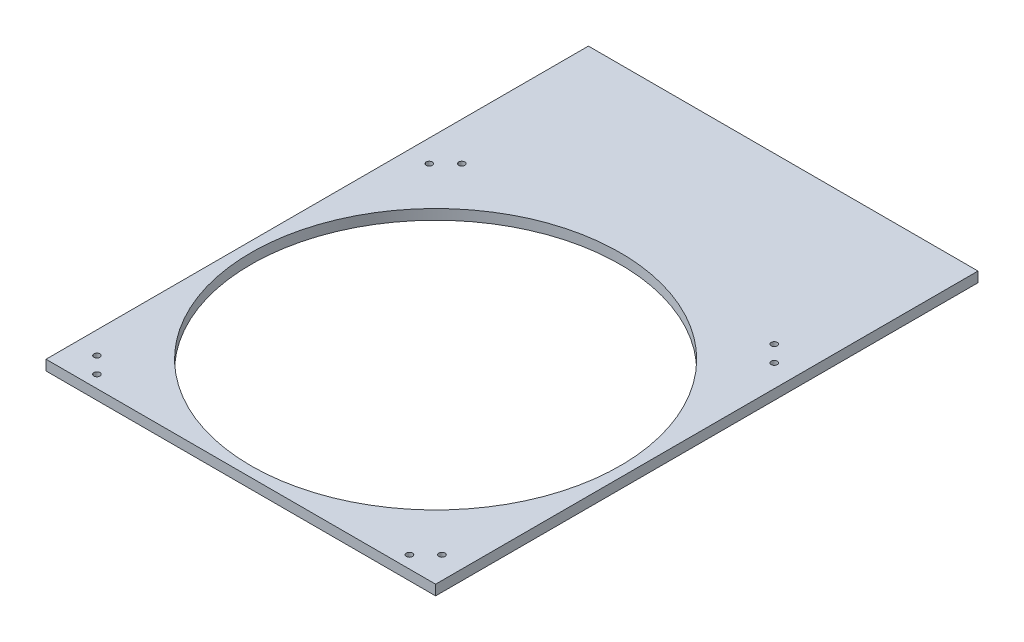
ISO-10303-21;
HEADER;
FILE_DESCRIPTION(('STEP AP214'),'2;1');
FILE_NAME('part.step','',(''),(''),'','','');
FILE_SCHEMA(('AUTOMOTIVE_DESIGN { 1 0 10303 214 1 1 1 1 }'));
ENDSEC;
DATA;
#1=APPLICATION_CONTEXT('core data for automotive mechanical design processes');
#2=APPLICATION_PROTOCOL_DEFINITION('international standard','automotive_design',2000,#1);
#3=PRODUCT_CONTEXT('',#1,'mechanical');
#4=PRODUCT('Part','Part','',(#3));
#5=PRODUCT_RELATED_PRODUCT_CATEGORY('part','',(#4));
#6=PRODUCT_DEFINITION_FORMATION('','',#4);
#7=PRODUCT_DEFINITION_CONTEXT('part definition',#1,'design');
#8=PRODUCT_DEFINITION('design','',#6,#7);
#9=PRODUCT_DEFINITION_SHAPE('','',#8);
#10=(LENGTH_UNIT() NAMED_UNIT(*) SI_UNIT(.MILLI.,.METRE.));
#11=(NAMED_UNIT(*) PLANE_ANGLE_UNIT() SI_UNIT($,.RADIAN.));
#12=(NAMED_UNIT(*) SI_UNIT($,.STERADIAN.) SOLID_ANGLE_UNIT());
#13=UNCERTAINTY_MEASURE_WITH_UNIT(LENGTH_MEASURE(1.E-05),#10,'distance_accuracy_value','');
#14=(GEOMETRIC_REPRESENTATION_CONTEXT(3) GLOBAL_UNCERTAINTY_ASSIGNED_CONTEXT((#13)) GLOBAL_UNIT_ASSIGNED_CONTEXT((#10,
#11,#12)) REPRESENTATION_CONTEXT('',''));
#15=CARTESIAN_POINT('',(0.,0.,0.));
#16=DIRECTION('',(0.,0.,1.));
#17=DIRECTION('',(1.,0.,0.));
#18=AXIS2_PLACEMENT_3D('',#15,#16,#17);
#19=CARTESIAN_POINT('',(0.,6.35,0.));
#20=DIRECTION('',(0.,1.,0.));
#21=DIRECTION('',(0.,0.,1.));
#22=AXIS2_PLACEMENT_3D('',#19,#20,#21);
#23=PLANE('',#22);
#24=CARTESIAN_POINT('',(333.354931760774,6.35,-271.862661640913));
#25=DIRECTION('',(0.,-1.,0.));
#26=DIRECTION('',(0.,0.,-1.));
#27=AXIS2_PLACEMENT_3D('',#24,#25,#26);
#28=CIRCLE('',#27,1.90500000000005);
#29=CARTESIAN_POINT('',(333.354931760774,6.35,-273.767661640913));
#30=VERTEX_POINT('',#29);
#31=EDGE_CURVE('E165',#30,#30,#28,.T.);
#32=ORIENTED_EDGE('',*,*,#31,.T.);
#33=EDGE_LOOP('',(#32));
#34=FACE_BOUND('',#33,.T.);
#35=CARTESIAN_POINT('',(333.354931760774,6.35,-44.4161144509628));
#36=DIRECTION('',(0.,-1.,0.));
#37=DIRECTION('',(0.,0.,1.));
#38=AXIS2_PLACEMENT_3D('',#35,#36,#37);
#39=CIRCLE('',#38,1.90500000000005);
#40=CARTESIAN_POINT('',(333.354931760774,6.35,-42.5111144509627));
#41=VERTEX_POINT('',#40);
#42=EDGE_CURVE('E150',#41,#41,#39,.T.);
#43=ORIENTED_EDGE('',*,*,#42,.T.);
#44=EDGE_LOOP('',(#43));
#45=FACE_BOUND('',#44,.T.);
#46=CARTESIAN_POINT('',(128.389000388147,6.35,-54.5535930135395));
#47=DIRECTION('',(0.,-1.,0.));
#48=DIRECTION('',(0.,0.,-1.));
#49=AXIS2_PLACEMENT_3D('',#46,#47,#48);
#50=CIRCLE('',#49,1.90499999999999);
#51=CARTESIAN_POINT('',(128.389000388147,6.35,-56.4585930135395));
#52=VERTEX_POINT('',#51);
#53=EDGE_CURVE('E149',#52,#52,#50,.T.);
#54=ORIENTED_EDGE('',*,*,#53,.T.);
#55=EDGE_LOOP('',(#54));
#56=FACE_BOUND('',#55,.T.);
#57=CARTESIAN_POINT('',(343.492410323351,6.35,-54.5535930135395));
#58=DIRECTION('',(0.,-1.,0.));
#59=DIRECTION('',(0.,0.,1.));
#60=AXIS2_PLACEMENT_3D('',#57,#58,#59);
#61=CIRCLE('',#60,1.90500000000005);
#62=CARTESIAN_POINT('',(343.492410323351,6.35,-52.6485930135394));
#63=VERTEX_POINT('',#62);
#64=EDGE_CURVE('E141',#63,#63,#61,.T.);
#65=ORIENTED_EDGE('',*,*,#64,.T.);
#66=EDGE_LOOP('',(#65));
#67=FACE_BOUND('',#66,.T.);
#68=CARTESIAN_POINT('',(343.492410323351,6.35,-261.725183078336));
#69=DIRECTION('',(0.,-1.,0.));
#70=DIRECTION('',(0.,0.,-1.));
#71=AXIS2_PLACEMENT_3D('',#68,#69,#70);
#72=CIRCLE('',#71,1.90500000000004);
#73=CARTESIAN_POINT('',(343.492410323351,6.35,-263.630183078336));
#74=VERTEX_POINT('',#73);
#75=EDGE_CURVE('E166',#74,#74,#72,.T.);
#76=ORIENTED_EDGE('',*,*,#75,.T.);
#77=EDGE_LOOP('',(#76));
#78=FACE_BOUND('',#77,.T.);
#79=CARTESIAN_POINT('',(128.389000388148,6.35,-261.725183078336));
#80=DIRECTION('',(0.,-1.,0.));
#81=DIRECTION('',(0.,0.,1.));
#82=AXIS2_PLACEMENT_3D('',#79,#80,#81);
#83=CIRCLE('',#82,1.90499999999998);
#84=CARTESIAN_POINT('',(128.389000388148,6.35,-259.820183078336));
#85=VERTEX_POINT('',#84);
#86=EDGE_CURVE('E189',#85,#85,#83,.T.);
#87=ORIENTED_EDGE('',*,*,#86,.T.);
#88=EDGE_LOOP('',(#87));
#89=FACE_BOUND('',#88,.T.);
#90=CARTESIAN_POINT('',(138.526478950724,6.35,-271.862661640913));
#91=DIRECTION('',(0.,-1.,0.));
#92=DIRECTION('',(0.,0.,1.));
#93=AXIS2_PLACEMENT_3D('',#90,#91,#92);
#94=CIRCLE('',#93,1.905);
#95=CARTESIAN_POINT('',(138.526478950724,6.35,-269.957661640913));
#96=VERTEX_POINT('',#95);
#97=EDGE_CURVE('E181',#96,#96,#94,.T.);
#98=ORIENTED_EDGE('',*,*,#97,.T.);
#99=EDGE_LOOP('',(#98));
#100=FACE_BOUND('',#99,.T.);
#101=CARTESIAN_POINT('',(138.526478950724,6.35,-44.4161144509628));
#102=DIRECTION('',(0.,-1.,0.));
#103=DIRECTION('',(0.,0.,-1.));
#104=AXIS2_PLACEMENT_3D('',#101,#102,#103);
#105=CIRCLE('',#104,1.90499999999999);
#106=CARTESIAN_POINT('',(138.526478950724,6.35,-46.3211144509628));
#107=VERTEX_POINT('',#106);
#108=EDGE_CURVE('E133',#107,#107,#105,.T.);
#109=ORIENTED_EDGE('',*,*,#108,.T.);
#110=EDGE_LOOP('',(#109));
#111=FACE_BOUND('',#110,.T.);
#112=DIRECTION('',(0.,0.,1.));
#113=VECTOR('',#112,1.);
#114=CARTESIAN_POINT('',(114.496955355749,6.35,-374.833138045938));
#115=LINE('',#114,#113);
#116=CARTESIAN_POINT('',(114.496955355749,6.35,-374.833138045938));
#117=VERTEX_POINT('',#116);
#118=CARTESIAN_POINT('',(114.496955355749,6.35,-36.6956380459377));
#119=VERTEX_POINT('',#118);
#120=EDGE_CURVE('E91',#117,#119,#115,.T.);
#121=ORIENTED_EDGE('',*,*,#120,.T.);
#122=DIRECTION('',(1.,0.,0.));
#123=VECTOR('',#122,1.);
#124=CARTESIAN_POINT('',(114.496955355749,6.35,-36.6956380459377));
#125=LINE('',#124,#123);
#126=CARTESIAN_POINT('',(357.384455355749,6.35,-36.6956380459377));
#127=VERTEX_POINT('',#126);
#128=EDGE_CURVE('E86',#119,#127,#125,.T.);
#129=ORIENTED_EDGE('',*,*,#128,.T.);
#130=DIRECTION('',(0.,0.,-1.));
#131=VECTOR('',#130,1.);
#132=CARTESIAN_POINT('',(357.384455355749,6.35,-374.833138045938));
#133=LINE('',#132,#131);
#134=CARTESIAN_POINT('',(357.384455355749,6.35,-374.833138045938));
#135=VERTEX_POINT('',#134);
#136=EDGE_CURVE('E89',#127,#135,#133,.T.);
#137=ORIENTED_EDGE('',*,*,#136,.T.);
#138=DIRECTION('',(-1.,0.,0.));
#139=VECTOR('',#138,1.);
#140=CARTESIAN_POINT('',(114.496955355749,6.35,-374.833138045938));
#141=LINE('',#140,#139);
#142=EDGE_CURVE('E56',#135,#117,#141,.T.);
#143=ORIENTED_EDGE('',*,*,#142,.T.);
#144=EDGE_LOOP('',(#121,#129,#137,#143));
#145=FACE_BOUND('',#144,.T.);
#146=CARTESIAN_POINT('',(235.940705355749,6.35,-158.139388045938));
#147=DIRECTION('',(0.,1.,0.));
#148=DIRECTION('',(0.,0.,1.));
#149=AXIS2_PLACEMENT_3D('',#146,#147,#148);
#150=CIRCLE('',#149,115.09375);
#151=CARTESIAN_POINT('',(235.940705355749,6.35,-43.0456380459377));
#152=VERTEX_POINT('',#151);
#153=EDGE_CURVE('E111',#152,#152,#150,.T.);
#154=ORIENTED_EDGE('',*,*,#153,.F.);
#155=EDGE_LOOP('',(#154));
#156=FACE_BOUND('',#155,.T.);
#157=ADVANCED_FACE('F38',(#34,#45,#56,#67,#78,#89,#100,#111,#145,#156),#23,.T.);
#158=CARTESIAN_POINT('',(0.,0.,0.));
#159=DIRECTION('',(0.,1.,0.));
#160=DIRECTION('',(0.,0.,1.));
#161=AXIS2_PLACEMENT_3D('',#158,#159,#160);
#162=PLANE('',#161);
#163=CARTESIAN_POINT('',(333.354931760774,0.,-271.862661640913));
#164=DIRECTION('',(0.,-1.,0.));
#165=DIRECTION('',(0.,0.,-1.));
#166=AXIS2_PLACEMENT_3D('',#163,#164,#165);
#167=CIRCLE('',#166,1.90500000000005);
#168=CARTESIAN_POINT('',(333.354931760774,0.,-273.767661640913));
#169=VERTEX_POINT('',#168);
#170=EDGE_CURVE('E161',#169,#169,#167,.T.);
#171=ORIENTED_EDGE('',*,*,#170,.F.);
#172=EDGE_LOOP('',(#171));
#173=FACE_BOUND('',#172,.T.);
#174=CARTESIAN_POINT('',(333.354931760774,0.,-44.4161144509628));
#175=DIRECTION('',(0.,-1.,0.));
#176=DIRECTION('',(0.,0.,1.));
#177=AXIS2_PLACEMENT_3D('',#174,#175,#176);
#178=CIRCLE('',#177,1.90500000000005);
#179=CARTESIAN_POINT('',(333.354931760774,0.,-42.5111144509627));
#180=VERTEX_POINT('',#179);
#181=EDGE_CURVE('E170',#180,#180,#178,.T.);
#182=ORIENTED_EDGE('',*,*,#181,.F.);
#183=EDGE_LOOP('',(#182));
#184=FACE_BOUND('',#183,.T.);
#185=CARTESIAN_POINT('',(128.389000388147,0.,-54.5535930135395));
#186=DIRECTION('',(0.,-1.,0.));
#187=DIRECTION('',(0.,0.,-1.));
#188=AXIS2_PLACEMENT_3D('',#185,#186,#187);
#189=CIRCLE('',#188,1.90499999999999);
#190=CARTESIAN_POINT('',(128.389000388147,0.,-56.4585930135395));
#191=VERTEX_POINT('',#190);
#192=EDGE_CURVE('E145',#191,#191,#189,.T.);
#193=ORIENTED_EDGE('',*,*,#192,.F.);
#194=EDGE_LOOP('',(#193));
#195=FACE_BOUND('',#194,.T.);
#196=CARTESIAN_POINT('',(343.492410323351,0.,-54.5535930135395));
#197=DIRECTION('',(0.,-1.,0.));
#198=DIRECTION('',(0.,0.,1.));
#199=AXIS2_PLACEMENT_3D('',#196,#197,#198);
#200=CIRCLE('',#199,1.90500000000005);
#201=CARTESIAN_POINT('',(343.492410323351,0.,-52.6485930135394));
#202=VERTEX_POINT('',#201);
#203=EDGE_CURVE('E154',#202,#202,#200,.T.);
#204=ORIENTED_EDGE('',*,*,#203,.F.);
#205=EDGE_LOOP('',(#204));
#206=FACE_BOUND('',#205,.T.);
#207=CARTESIAN_POINT('',(343.492410323351,0.,-261.725183078336));
#208=DIRECTION('',(0.,-1.,0.));
#209=DIRECTION('',(0.,0.,-1.));
#210=AXIS2_PLACEMENT_3D('',#207,#208,#209);
#211=CIRCLE('',#210,1.90500000000004);
#212=CARTESIAN_POINT('',(343.492410323351,0.,-263.630183078336));
#213=VERTEX_POINT('',#212);
#214=EDGE_CURVE('E193',#213,#213,#211,.T.);
#215=ORIENTED_EDGE('',*,*,#214,.F.);
#216=EDGE_LOOP('',(#215));
#217=FACE_BOUND('',#216,.T.);
#218=CARTESIAN_POINT('',(128.389000388148,0.,-261.725183078336));
#219=DIRECTION('',(0.,-1.,0.));
#220=DIRECTION('',(0.,0.,1.));
#221=AXIS2_PLACEMENT_3D('',#218,#219,#220);
#222=CIRCLE('',#221,1.90499999999998);
#223=CARTESIAN_POINT('',(128.389000388148,0.,-259.820183078336));
#224=VERTEX_POINT('',#223);
#225=EDGE_CURVE('E185',#224,#224,#222,.T.);
#226=ORIENTED_EDGE('',*,*,#225,.F.);
#227=EDGE_LOOP('',(#226));
#228=FACE_BOUND('',#227,.T.);
#229=CARTESIAN_POINT('',(138.526478950724,0.,-271.862661640913));
#230=DIRECTION('',(0.,-1.,0.));
#231=DIRECTION('',(0.,0.,1.));
#232=AXIS2_PLACEMENT_3D('',#229,#230,#231);
#233=CIRCLE('',#232,1.905);
#234=CARTESIAN_POINT('',(138.526478950724,0.,-269.957661640913));
#235=VERTEX_POINT('',#234);
#236=EDGE_CURVE('E177',#235,#235,#233,.T.);
#237=ORIENTED_EDGE('',*,*,#236,.F.);
#238=EDGE_LOOP('',(#237));
#239=FACE_BOUND('',#238,.T.);
#240=CARTESIAN_POINT('',(138.526478950724,0.,-44.4161144509628));
#241=DIRECTION('',(0.,-1.,0.));
#242=DIRECTION('',(0.,0.,-1.));
#243=AXIS2_PLACEMENT_3D('',#240,#241,#242);
#244=CIRCLE('',#243,1.90499999999999);
#245=CARTESIAN_POINT('',(138.526478950724,0.,-46.3211144509628));
#246=VERTEX_POINT('',#245);
#247=EDGE_CURVE('E137',#246,#246,#244,.T.);
#248=ORIENTED_EDGE('',*,*,#247,.F.);
#249=EDGE_LOOP('',(#248));
#250=FACE_BOUND('',#249,.T.);
#251=DIRECTION('',(0.,0.,1.));
#252=VECTOR('',#251,1.);
#253=CARTESIAN_POINT('',(114.496955355749,0.,-374.833138045938));
#254=LINE('',#253,#252);
#255=CARTESIAN_POINT('',(114.496955355749,0.,-374.833138045938));
#256=VERTEX_POINT('',#255);
#257=CARTESIAN_POINT('',(114.496955355749,0.,-36.6956380459377));
#258=VERTEX_POINT('',#257);
#259=EDGE_CURVE('E107',#256,#258,#254,.T.);
#260=ORIENTED_EDGE('',*,*,#259,.F.);
#261=DIRECTION('',(-1.,0.,0.));
#262=VECTOR('',#261,1.);
#263=CARTESIAN_POINT('',(114.496955355749,0.,-374.833138045938));
#264=LINE('',#263,#262);
#265=CARTESIAN_POINT('',(357.384455355749,0.,-374.833138045938));
#266=VERTEX_POINT('',#265);
#267=EDGE_CURVE('E79',#266,#256,#264,.T.);
#268=ORIENTED_EDGE('',*,*,#267,.F.);
#269=DIRECTION('',(0.,0.,-1.));
#270=VECTOR('',#269,1.);
#271=CARTESIAN_POINT('',(357.384455355749,0.,-374.833138045938));
#272=LINE('',#271,#270);
#273=CARTESIAN_POINT('',(357.384455355749,0.,-36.6956380459377));
#274=VERTEX_POINT('',#273);
#275=EDGE_CURVE('E73',#274,#266,#272,.T.);
#276=ORIENTED_EDGE('',*,*,#275,.F.);
#277=DIRECTION('',(1.,0.,0.));
#278=VECTOR('',#277,1.);
#279=CARTESIAN_POINT('',(114.496955355749,0.,-36.6956380459377));
#280=LINE('',#279,#278);
#281=EDGE_CURVE('E96',#258,#274,#280,.T.);
#282=ORIENTED_EDGE('',*,*,#281,.F.);
#283=EDGE_LOOP('',(#260,#268,#276,#282));
#284=FACE_BOUND('',#283,.T.);
#285=CARTESIAN_POINT('',(235.940705355749,0.,-158.139388045938));
#286=DIRECTION('',(0.,1.,0.));
#287=DIRECTION('',(0.,0.,1.));
#288=AXIS2_PLACEMENT_3D('',#285,#286,#287);
#289=CIRCLE('',#288,115.09375);
#290=CARTESIAN_POINT('',(235.940705355749,0.,-43.0456380459377));
#291=VERTEX_POINT('',#290);
#292=EDGE_CURVE('E129',#291,#291,#289,.T.);
#293=ORIENTED_EDGE('',*,*,#292,.T.);
#294=EDGE_LOOP('',(#293));
#295=FACE_BOUND('',#294,.T.);
#296=ADVANCED_FACE('F124',(#173,#184,#195,#206,#217,#228,#239,#250,#284,#295),#162,.F.);
#297=CARTESIAN_POINT('',(114.496955355749,6.35,-374.833138045938));
#298=DIRECTION('',(1.,0.,0.));
#299=DIRECTION('',(0.,0.,-1.));
#300=AXIS2_PLACEMENT_3D('',#297,#298,#299);
#301=PLANE('',#300);
#302=ORIENTED_EDGE('',*,*,#259,.T.);
#303=DIRECTION('',(0.,-1.,0.));
#304=VECTOR('',#303,1.);
#305=CARTESIAN_POINT('',(114.496955355749,6.35,-36.6956380459377));
#306=LINE('',#305,#304);
#307=EDGE_CURVE('E11',#119,#258,#306,.T.);
#308=ORIENTED_EDGE('',*,*,#307,.F.);
#309=ORIENTED_EDGE('',*,*,#120,.F.);
#310=DIRECTION('',(0.,-1.,0.));
#311=VECTOR('',#310,1.);
#312=CARTESIAN_POINT('',(114.496955355749,6.35,-374.833138045938));
#313=LINE('',#312,#311);
#314=EDGE_CURVE('E103',#117,#256,#313,.T.);
#315=ORIENTED_EDGE('',*,*,#314,.T.);
#316=EDGE_LOOP('',(#302,#308,#309,#315));
#317=FACE_BOUND('',#316,.T.);
#318=ADVANCED_FACE('F40',(#317),#301,.F.);
#319=CARTESIAN_POINT('',(114.496955355749,6.35,-36.6956380459377));
#320=DIRECTION('',(0.,0.,-1.));
#321=DIRECTION('',(-1.,0.,0.));
#322=AXIS2_PLACEMENT_3D('',#319,#320,#321);
#323=PLANE('',#322);
#324=ORIENTED_EDGE('',*,*,#281,.T.);
#325=DIRECTION('',(0.,-1.,0.));
#326=VECTOR('',#325,1.);
#327=CARTESIAN_POINT('',(357.384455355749,6.35,-36.6956380459377));
#328=LINE('',#327,#326);
#329=EDGE_CURVE('E48',#127,#274,#328,.T.);
#330=ORIENTED_EDGE('',*,*,#329,.F.);
#331=ORIENTED_EDGE('',*,*,#128,.F.);
#332=ORIENTED_EDGE('',*,*,#307,.T.);
#333=EDGE_LOOP('',(#324,#330,#331,#332));
#334=FACE_BOUND('',#333,.T.);
#335=ADVANCED_FACE('F95',(#334),#323,.F.);
#336=CARTESIAN_POINT('',(357.384455355749,6.35,-374.833138045938));
#337=DIRECTION('',(-1.,0.,0.));
#338=DIRECTION('',(0.,0.,1.));
#339=AXIS2_PLACEMENT_3D('',#336,#337,#338);
#340=PLANE('',#339);
#341=ORIENTED_EDGE('',*,*,#275,.T.);
#342=DIRECTION('',(0.,-1.,0.));
#343=VECTOR('',#342,1.);
#344=CARTESIAN_POINT('',(357.384455355749,6.35,-374.833138045938));
#345=LINE('',#344,#343);
#346=EDGE_CURVE('E98',#135,#266,#345,.T.);
#347=ORIENTED_EDGE('',*,*,#346,.F.);
#348=ORIENTED_EDGE('',*,*,#136,.F.);
#349=ORIENTED_EDGE('',*,*,#329,.T.);
#350=EDGE_LOOP('',(#341,#347,#348,#349));
#351=FACE_BOUND('',#350,.T.);
#352=ADVANCED_FACE('F99',(#351),#340,.F.);
#353=CARTESIAN_POINT('',(114.496955355749,6.35,-374.833138045938));
#354=DIRECTION('',(0.,0.,1.));
#355=DIRECTION('',(1.,0.,0.));
#356=AXIS2_PLACEMENT_3D('',#353,#354,#355);
#357=PLANE('',#356);
#358=ORIENTED_EDGE('',*,*,#267,.T.);
#359=ORIENTED_EDGE('',*,*,#314,.F.);
#360=ORIENTED_EDGE('',*,*,#142,.F.);
#361=ORIENTED_EDGE('',*,*,#346,.T.);
#362=EDGE_LOOP('',(#358,#359,#360,#361));
#363=FACE_BOUND('',#362,.T.);
#364=ADVANCED_FACE('F121',(#363),#357,.F.);
#365=CARTESIAN_POINT('',(235.940705355749,6.35,-158.139388045938));
#366=DIRECTION('',(0.,-1.,0.));
#367=DIRECTION('',(0.,0.,-1.));
#368=AXIS2_PLACEMENT_3D('',#365,#366,#367);
#369=CYLINDRICAL_SURFACE('',#368,115.09375);
#370=ORIENTED_EDGE('',*,*,#153,.T.);
#371=EDGE_LOOP('',(#370));
#372=FACE_BOUND('',#371,.T.);
#373=ORIENTED_EDGE('',*,*,#292,.F.);
#374=EDGE_LOOP('',(#373));
#375=FACE_BOUND('',#374,.T.);
#376=ADVANCED_FACE('F224',(#372,#375),#369,.F.);
#377=CARTESIAN_POINT('',(138.526478950724,6.35,-44.4161144509628));
#378=DIRECTION('',(0.,-1.,0.));
#379=DIRECTION('',(0.,0.,-1.));
#380=AXIS2_PLACEMENT_3D('',#377,#378,#379);
#381=CYLINDRICAL_SURFACE('',#380,1.90499999999999);
#382=ORIENTED_EDGE('',*,*,#108,.F.);
#383=EDGE_LOOP('',(#382));
#384=FACE_BOUND('',#383,.T.);
#385=ORIENTED_EDGE('',*,*,#247,.T.);
#386=EDGE_LOOP('',(#385));
#387=FACE_BOUND('',#386,.T.);
#388=ADVANCED_FACE('F221',(#384,#387),#381,.F.);
#389=CARTESIAN_POINT('',(138.526478950724,6.35,-271.862661640913));
#390=DIRECTION('',(0.,-1.,0.));
#391=DIRECTION('',(0.,0.,-1.));
#392=AXIS2_PLACEMENT_3D('',#389,#390,#391);
#393=CYLINDRICAL_SURFACE('',#392,1.905);
#394=ORIENTED_EDGE('',*,*,#97,.F.);
#395=EDGE_LOOP('',(#394));
#396=FACE_BOUND('',#395,.T.);
#397=ORIENTED_EDGE('',*,*,#236,.T.);
#398=EDGE_LOOP('',(#397));
#399=FACE_BOUND('',#398,.T.);
#400=ADVANCED_FACE('F223',(#396,#399),#393,.F.);
#401=CARTESIAN_POINT('',(128.389000388148,6.35,-261.725183078336));
#402=DIRECTION('',(0.,-1.,0.));
#403=DIRECTION('',(0.,0.,-1.));
#404=AXIS2_PLACEMENT_3D('',#401,#402,#403);
#405=CYLINDRICAL_SURFACE('',#404,1.90499999999998);
#406=ORIENTED_EDGE('',*,*,#86,.F.);
#407=EDGE_LOOP('',(#406));
#408=FACE_BOUND('',#407,.T.);
#409=ORIENTED_EDGE('',*,*,#225,.T.);
#410=EDGE_LOOP('',(#409));
#411=FACE_BOUND('',#410,.T.);
#412=ADVANCED_FACE('F207',(#408,#411),#405,.F.);
#413=CARTESIAN_POINT('',(343.492410323351,6.35,-261.725183078336));
#414=DIRECTION('',(0.,-1.,0.));
#415=DIRECTION('',(0.,0.,-1.));
#416=AXIS2_PLACEMENT_3D('',#413,#414,#415);
#417=CYLINDRICAL_SURFACE('',#416,1.90500000000004);
#418=ORIENTED_EDGE('',*,*,#75,.F.);
#419=EDGE_LOOP('',(#418));
#420=FACE_BOUND('',#419,.T.);
#421=ORIENTED_EDGE('',*,*,#214,.T.);
#422=EDGE_LOOP('',(#421));
#423=FACE_BOUND('',#422,.T.);
#424=ADVANCED_FACE('F203',(#420,#423),#417,.F.);
#425=CARTESIAN_POINT('',(343.492410323351,6.35,-54.5535930135395));
#426=DIRECTION('',(0.,-1.,0.));
#427=DIRECTION('',(0.,0.,-1.));
#428=AXIS2_PLACEMENT_3D('',#425,#426,#427);
#429=CYLINDRICAL_SURFACE('',#428,1.90500000000005);
#430=ORIENTED_EDGE('',*,*,#64,.F.);
#431=EDGE_LOOP('',(#430));
#432=FACE_BOUND('',#431,.T.);
#433=ORIENTED_EDGE('',*,*,#203,.T.);
#434=EDGE_LOOP('',(#433));
#435=FACE_BOUND('',#434,.T.);
#436=ADVANCED_FACE('F206',(#432,#435),#429,.F.);
#437=CARTESIAN_POINT('',(128.389000388147,6.35,-54.5535930135395));
#438=DIRECTION('',(0.,-1.,0.));
#439=DIRECTION('',(0.,0.,-1.));
#440=AXIS2_PLACEMENT_3D('',#437,#438,#439);
#441=CYLINDRICAL_SURFACE('',#440,1.90499999999999);
#442=ORIENTED_EDGE('',*,*,#53,.F.);
#443=EDGE_LOOP('',(#442));
#444=FACE_BOUND('',#443,.T.);
#445=ORIENTED_EDGE('',*,*,#192,.T.);
#446=EDGE_LOOP('',(#445));
#447=FACE_BOUND('',#446,.T.);
#448=ADVANCED_FACE('F297',(#444,#447),#441,.F.);
#449=CARTESIAN_POINT('',(333.354931760774,6.35,-44.4161144509628));
#450=DIRECTION('',(0.,-1.,0.));
#451=DIRECTION('',(0.,0.,-1.));
#452=AXIS2_PLACEMENT_3D('',#449,#450,#451);
#453=CYLINDRICAL_SURFACE('',#452,1.90500000000005);
#454=ORIENTED_EDGE('',*,*,#42,.F.);
#455=EDGE_LOOP('',(#454));
#456=FACE_BOUND('',#455,.T.);
#457=ORIENTED_EDGE('',*,*,#181,.T.);
#458=EDGE_LOOP('',(#457));
#459=FACE_BOUND('',#458,.T.);
#460=ADVANCED_FACE('F307',(#456,#459),#453,.F.);
#461=CARTESIAN_POINT('',(333.354931760774,6.35,-271.862661640913));
#462=DIRECTION('',(0.,-1.,0.));
#463=DIRECTION('',(0.,0.,-1.));
#464=AXIS2_PLACEMENT_3D('',#461,#462,#463);
#465=CYLINDRICAL_SURFACE('',#464,1.90500000000005);
#466=ORIENTED_EDGE('',*,*,#31,.F.);
#467=EDGE_LOOP('',(#466));
#468=FACE_BOUND('',#467,.T.);
#469=ORIENTED_EDGE('',*,*,#170,.T.);
#470=EDGE_LOOP('',(#469));
#471=FACE_BOUND('',#470,.T.);
#472=ADVANCED_FACE('F316',(#468,#471),#465,.F.);
#473=CLOSED_SHELL('',(#157,#296,#318,#335,#352,#364,#376,#388,#400,#412,#424,#436,#448,#460,#472));
#474=MANIFOLD_SOLID_BREP('B2',#473);
#475=ADVANCED_BREP_SHAPE_REPRESENTATION('',(#18,#474),#14);
#476=SHAPE_DEFINITION_REPRESENTATION(#9,#475);
ENDSEC;
END-ISO-10303-21;
